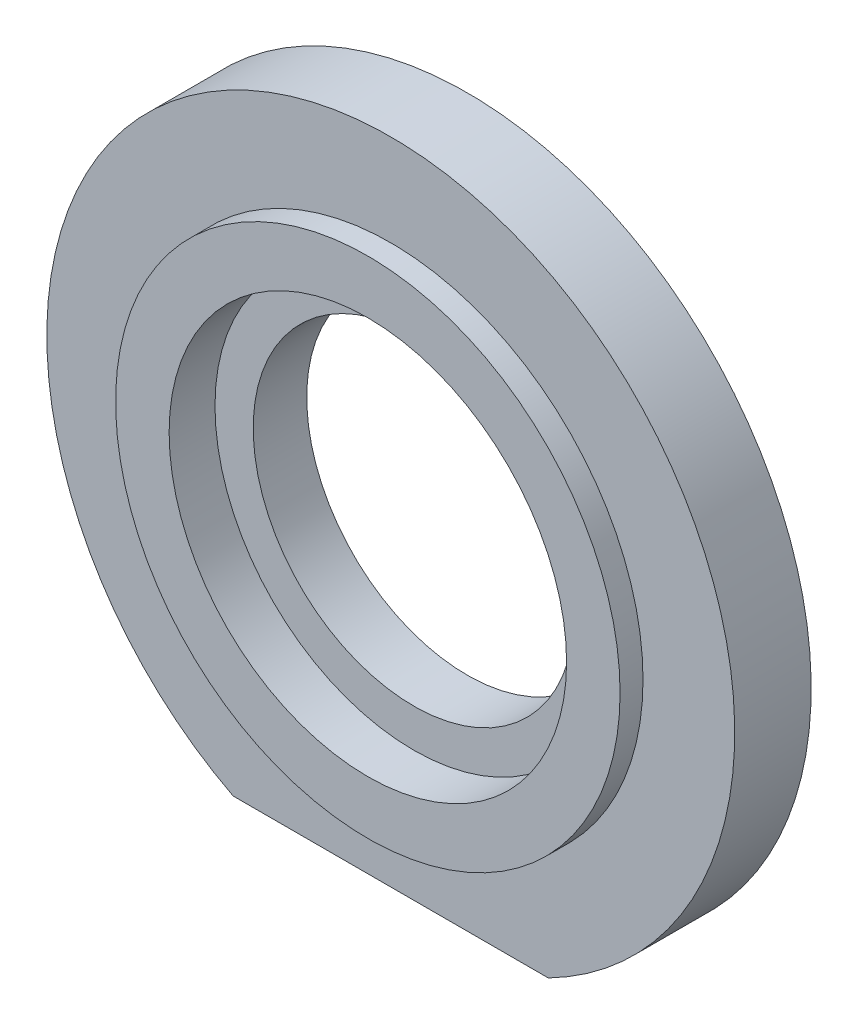
ISO-10303-21;
HEADER;
FILE_DESCRIPTION(('STEP AP214'),'2;1');
FILE_NAME('part.step','',(''),(''),'','','');
FILE_SCHEMA(('AUTOMOTIVE_DESIGN { 1 0 10303 214 1 1 1 1 }'));
ENDSEC;
DATA;
#1=APPLICATION_CONTEXT('core data for automotive mechanical design processes');
#2=APPLICATION_PROTOCOL_DEFINITION('international standard','automotive_design',2000,#1);
#3=PRODUCT_CONTEXT('',#1,'mechanical');
#4=PRODUCT('Part','Part','',(#3));
#5=PRODUCT_RELATED_PRODUCT_CATEGORY('part','',(#4));
#6=PRODUCT_DEFINITION_FORMATION('','',#4);
#7=PRODUCT_DEFINITION_CONTEXT('part definition',#1,'design');
#8=PRODUCT_DEFINITION('design','',#6,#7);
#9=PRODUCT_DEFINITION_SHAPE('','',#8);
#10=(LENGTH_UNIT() NAMED_UNIT(*) SI_UNIT(.MILLI.,.METRE.));
#11=(NAMED_UNIT(*) PLANE_ANGLE_UNIT() SI_UNIT($,.RADIAN.));
#12=(NAMED_UNIT(*) SI_UNIT($,.STERADIAN.) SOLID_ANGLE_UNIT());
#13=UNCERTAINTY_MEASURE_WITH_UNIT(LENGTH_MEASURE(1.E-05),#10,'distance_accuracy_value','');
#14=(GEOMETRIC_REPRESENTATION_CONTEXT(3) GLOBAL_UNCERTAINTY_ASSIGNED_CONTEXT((#13)) GLOBAL_UNIT_ASSIGNED_CONTEXT((#10,
#11,#12)) REPRESENTATION_CONTEXT('',''));
#15=CARTESIAN_POINT('',(0.,0.,0.));
#16=DIRECTION('',(0.,0.,1.));
#17=DIRECTION('',(1.,0.,0.));
#18=AXIS2_PLACEMENT_3D('',#15,#16,#17);
#19=CARTESIAN_POINT('',(0.,29.4567635839866,10.));
#20=DIRECTION('',(0.,0.,-1.));
#21=DIRECTION('',(-1.,0.,0.));
#22=AXIS2_PLACEMENT_3D('',#19,#20,#21);
#23=CYLINDRICAL_SURFACE('',#22,21.);
#24=CARTESIAN_POINT('',(0.,29.4567635839866,0.));
#25=DIRECTION('',(0.,0.,1.));
#26=DIRECTION('',(1.,0.,0.));
#27=AXIS2_PLACEMENT_3D('',#24,#25,#26);
#28=CIRCLE('',#27,21.);
#29=CARTESIAN_POINT('',(21.,29.4567635839866,0.));
#30=VERTEX_POINT('',#29);
#31=EDGE_CURVE('E76',#30,#30,#28,.T.);
#32=ORIENTED_EDGE('',*,*,#31,.F.);
#33=EDGE_LOOP('',(#32));
#34=FACE_BOUND('',#33,.T.);
#35=CARTESIAN_POINT('',(0.,29.4567635839866,7.));
#36=DIRECTION('',(0.,0.,1.));
#37=DIRECTION('',(1.,0.,0.));
#38=AXIS2_PLACEMENT_3D('',#35,#36,#37);
#39=CIRCLE('',#38,21.);
#40=CARTESIAN_POINT('',(21.,29.4567635839866,7.));
#41=VERTEX_POINT('',#40);
#42=EDGE_CURVE('E42',#41,#41,#39,.T.);
#43=ORIENTED_EDGE('',*,*,#42,.T.);
#44=EDGE_LOOP('',(#43));
#45=FACE_BOUND('',#44,.T.);
#46=ADVANCED_FACE('F38',(#34,#45),#23,.F.);
#47=CARTESIAN_POINT('',(0.,29.4567635839866,10.));
#48=DIRECTION('',(0.,0.,1.));
#49=DIRECTION('',(1.,0.,0.));
#50=AXIS2_PLACEMENT_3D('',#47,#48,#49);
#51=PLANE('',#50);
#52=DIRECTION('',(-1.,0.,0.));
#53=VECTOR('',#52,1.);
#54=CARTESIAN_POINT('',(0.,-10.5432364160134,10.));
#55=LINE('',#54,#53);
#56=CARTESIAN_POINT('',(20.6155281280883,-10.5432364160134,10.));
#57=VERTEX_POINT('',#56);
#58=CARTESIAN_POINT('',(-20.6155281280883,-10.5432364160134,10.));
#59=VERTEX_POINT('',#58);
#60=EDGE_CURVE('E54',#57,#59,#55,.T.);
#61=ORIENTED_EDGE('',*,*,#60,.F.);
#62=CARTESIAN_POINT('',(0.,29.4567635839866,10.));
#63=DIRECTION('',(0.,0.,1.));
#64=DIRECTION('',(1.,0.,0.));
#65=AXIS2_PLACEMENT_3D('',#62,#63,#64);
#66=CIRCLE('',#65,45.);
#67=EDGE_CURVE('E68',#57,#59,#66,.T.);
#68=ORIENTED_EDGE('',*,*,#67,.T.);
#69=EDGE_LOOP('',(#61,#68));
#70=FACE_BOUND('',#69,.T.);
#71=CARTESIAN_POINT('',(0.,29.4567635839866,10.));
#72=DIRECTION('',(0.,0.,1.));
#73=DIRECTION('',(1.,0.,0.));
#74=AXIS2_PLACEMENT_3D('',#71,#72,#73);
#75=CIRCLE('',#74,33.);
#76=CARTESIAN_POINT('',(33.,29.4567635839866,10.));
#77=VERTEX_POINT('',#76);
#78=EDGE_CURVE('E83',#77,#77,#75,.T.);
#79=ORIENTED_EDGE('',*,*,#78,.F.);
#80=EDGE_LOOP('',(#79));
#81=FACE_BOUND('',#80,.T.);
#82=ADVANCED_FACE('F110',(#70,#81),#51,.T.);
#83=CARTESIAN_POINT('',(0.,29.4567635839866,0.));
#84=DIRECTION('',(0.,0.,1.));
#85=DIRECTION('',(1.,0.,0.));
#86=AXIS2_PLACEMENT_3D('',#83,#84,#85);
#87=PLANE('',#86);
#88=CARTESIAN_POINT('',(0.,29.4567635839866,0.));
#89=DIRECTION('',(0.,0.,1.));
#90=DIRECTION('',(1.,0.,0.));
#91=AXIS2_PLACEMENT_3D('',#88,#89,#90);
#92=CIRCLE('',#91,45.);
#93=CARTESIAN_POINT('',(20.6155281280883,-10.5432364160134,0.));
#94=VERTEX_POINT('',#93);
#95=CARTESIAN_POINT('',(-20.6155281280883,-10.5432364160134,0.));
#96=VERTEX_POINT('',#95);
#97=EDGE_CURVE('E74',#94,#96,#92,.T.);
#98=ORIENTED_EDGE('',*,*,#97,.F.);
#99=DIRECTION('',(1.,0.,0.));
#100=VECTOR('',#99,1.);
#101=CARTESIAN_POINT('',(20.6155281280883,-10.5432364160134,0.));
#102=LINE('',#101,#100);
#103=EDGE_CURVE('E63',#96,#94,#102,.T.);
#104=ORIENTED_EDGE('',*,*,#103,.F.);
#105=EDGE_LOOP('',(#98,#104));
#106=FACE_BOUND('',#105,.T.);
#107=ORIENTED_EDGE('',*,*,#31,.T.);
#108=EDGE_LOOP('',(#107));
#109=FACE_BOUND('',#108,.T.);
#110=ADVANCED_FACE('F72',(#106,#109),#87,.F.);
#111=CARTESIAN_POINT('',(0.,29.4567635839866,10.));
#112=DIRECTION('',(0.,0.,-1.));
#113=DIRECTION('',(-1.,0.,0.));
#114=AXIS2_PLACEMENT_3D('',#111,#112,#113);
#115=CYLINDRICAL_SURFACE('',#114,45.);
#116=ORIENTED_EDGE('',*,*,#67,.F.);
#117=DIRECTION('',(0.,0.,-1.));
#118=VECTOR('',#117,1.);
#119=CARTESIAN_POINT('',(20.6155281280883,-10.5432364160134,10.));
#120=LINE('',#119,#118);
#121=EDGE_CURVE('E11',#57,#94,#120,.T.);
#122=ORIENTED_EDGE('',*,*,#121,.T.);
#123=ORIENTED_EDGE('',*,*,#97,.T.);
#124=DIRECTION('',(0.,0.,-1.));
#125=VECTOR('',#124,1.);
#126=CARTESIAN_POINT('',(-20.6155281280883,-10.5432364160134,10.));
#127=LINE('',#126,#125);
#128=EDGE_CURVE('E47',#96,#59,#127,.F.);
#129=ORIENTED_EDGE('',*,*,#128,.T.);
#130=EDGE_LOOP('',(#116,#122,#123,#129));
#131=FACE_BOUND('',#130,.T.);
#132=ADVANCED_FACE('F40',(#131),#115,.T.);
#133=CARTESIAN_POINT('',(0.,29.4567635839866,13.));
#134=DIRECTION('',(0.,0.,1.));
#135=DIRECTION('',(1.,0.,0.));
#136=AXIS2_PLACEMENT_3D('',#133,#134,#135);
#137=PLANE('',#136);
#138=CARTESIAN_POINT('',(0.,29.4567635839866,13.));
#139=DIRECTION('',(0.,0.,1.));
#140=DIRECTION('',(1.,0.,0.));
#141=AXIS2_PLACEMENT_3D('',#138,#139,#140);
#142=CIRCLE('',#141,26.);
#143=CARTESIAN_POINT('',(26.,29.4567635839866,13.));
#144=VERTEX_POINT('',#143);
#145=EDGE_CURVE('E89',#144,#144,#142,.T.);
#146=ORIENTED_EDGE('',*,*,#145,.F.);
#147=EDGE_LOOP('',(#146));
#148=FACE_BOUND('',#147,.T.);
#149=CARTESIAN_POINT('',(0.,29.4567635839866,13.));
#150=DIRECTION('',(0.,0.,1.));
#151=DIRECTION('',(1.,0.,0.));
#152=AXIS2_PLACEMENT_3D('',#149,#150,#151);
#153=CIRCLE('',#152,33.);
#154=CARTESIAN_POINT('',(33.,29.4567635839866,13.));
#155=VERTEX_POINT('',#154);
#156=EDGE_CURVE('E80',#155,#155,#153,.T.);
#157=ORIENTED_EDGE('',*,*,#156,.T.);
#158=EDGE_LOOP('',(#157));
#159=FACE_BOUND('',#158,.T.);
#160=ADVANCED_FACE('F126',(#148,#159),#137,.T.);
#161=CARTESIAN_POINT('',(0.,29.4567635839866,13.));
#162=DIRECTION('',(0.,0.,-1.));
#163=DIRECTION('',(-1.,0.,0.));
#164=AXIS2_PLACEMENT_3D('',#161,#162,#163);
#165=CYLINDRICAL_SURFACE('',#164,33.);
#166=ORIENTED_EDGE('',*,*,#156,.F.);
#167=EDGE_LOOP('',(#166));
#168=FACE_BOUND('',#167,.T.);
#169=ORIENTED_EDGE('',*,*,#78,.T.);
#170=EDGE_LOOP('',(#169));
#171=FACE_BOUND('',#170,.T.);
#172=ADVANCED_FACE('F120',(#168,#171),#165,.T.);
#173=CARTESIAN_POINT('',(20.6155281280883,-10.5432364160134,13.));
#174=DIRECTION('',(0.,1.,0.));
#175=DIRECTION('',(0.,0.,1.));
#176=AXIS2_PLACEMENT_3D('',#173,#174,#175);
#177=PLANE('',#176);
#178=ORIENTED_EDGE('',*,*,#60,.T.);
#179=ORIENTED_EDGE('',*,*,#128,.F.);
#180=ORIENTED_EDGE('',*,*,#103,.T.);
#181=ORIENTED_EDGE('',*,*,#121,.F.);
#182=EDGE_LOOP('',(#178,#179,#180,#181));
#183=FACE_BOUND('',#182,.T.);
#184=ADVANCED_FACE('F62',(#183),#177,.F.);
#185=CARTESIAN_POINT('',(0.,29.4567635839866,7.));
#186=DIRECTION('',(0.,0.,1.));
#187=DIRECTION('',(1.,0.,0.));
#188=AXIS2_PLACEMENT_3D('',#185,#186,#187);
#189=CYLINDRICAL_SURFACE('',#188,26.);
#190=CARTESIAN_POINT('',(0.,29.4567635839866,7.));
#191=DIRECTION('',(0.,0.,1.));
#192=DIRECTION('',(1.,0.,0.));
#193=AXIS2_PLACEMENT_3D('',#190,#191,#192);
#194=CIRCLE('',#193,26.);
#195=CARTESIAN_POINT('',(26.,29.4567635839866,7.));
#196=VERTEX_POINT('',#195);
#197=EDGE_CURVE('E92',#196,#196,#194,.T.);
#198=ORIENTED_EDGE('',*,*,#197,.F.);
#199=EDGE_LOOP('',(#198));
#200=FACE_BOUND('',#199,.T.);
#201=ORIENTED_EDGE('',*,*,#145,.T.);
#202=EDGE_LOOP('',(#201));
#203=FACE_BOUND('',#202,.T.);
#204=ADVANCED_FACE('F102',(#200,#203),#189,.F.);
#205=CARTESIAN_POINT('',(0.,29.4567635839866,7.));
#206=DIRECTION('',(0.,0.,1.));
#207=DIRECTION('',(1.,0.,0.));
#208=AXIS2_PLACEMENT_3D('',#205,#206,#207);
#209=PLANE('',#208);
#210=ORIENTED_EDGE('',*,*,#42,.F.);
#211=EDGE_LOOP('',(#210));
#212=FACE_BOUND('',#211,.T.);
#213=ORIENTED_EDGE('',*,*,#197,.T.);
#214=EDGE_LOOP('',(#213));
#215=FACE_BOUND('',#214,.T.);
#216=ADVANCED_FACE('F100',(#212,#215),#209,.T.);
#217=CLOSED_SHELL('',(#46,#82,#110,#132,#160,#172,#184,#204,#216));
#218=MANIFOLD_SOLID_BREP('B2',#217);
#219=ADVANCED_BREP_SHAPE_REPRESENTATION('',(#18,#218),#14);
#220=SHAPE_DEFINITION_REPRESENTATION(#9,#219);
ENDSEC;
END-ISO-10303-21;
